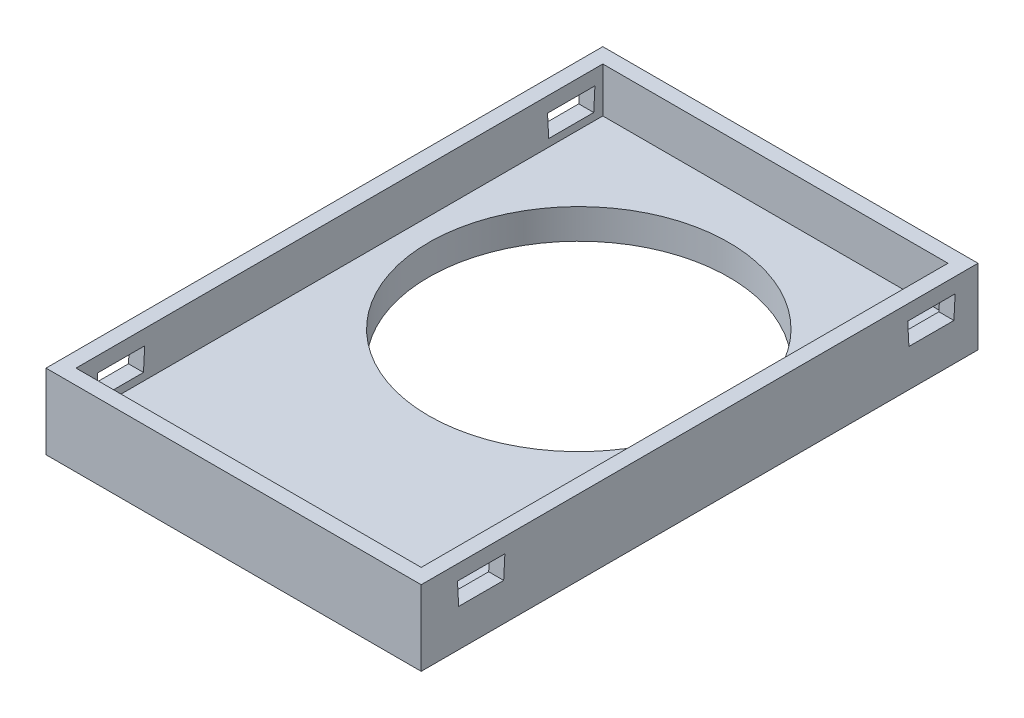
ISO-10303-21;
HEADER;
FILE_DESCRIPTION(('STEP AP214'),'2;1');
FILE_NAME('part.step','',(''),(''),'','','');
FILE_SCHEMA(('AUTOMOTIVE_DESIGN { 1 0 10303 214 1 1 1 1 }'));
ENDSEC;
DATA;
#1=APPLICATION_CONTEXT('core data for automotive mechanical design processes');
#2=APPLICATION_PROTOCOL_DEFINITION('international standard','automotive_design',2000,#1);
#3=PRODUCT_CONTEXT('',#1,'mechanical');
#4=PRODUCT('Part','Part','',(#3));
#5=PRODUCT_RELATED_PRODUCT_CATEGORY('part','',(#4));
#6=PRODUCT_DEFINITION_FORMATION('','',#4);
#7=PRODUCT_DEFINITION_CONTEXT('part definition',#1,'design');
#8=PRODUCT_DEFINITION('design','',#6,#7);
#9=PRODUCT_DEFINITION_SHAPE('','',#8);
#10=(LENGTH_UNIT() NAMED_UNIT(*) SI_UNIT(.MILLI.,.METRE.));
#11=(NAMED_UNIT(*) PLANE_ANGLE_UNIT() SI_UNIT($,.RADIAN.));
#12=(NAMED_UNIT(*) SI_UNIT($,.STERADIAN.) SOLID_ANGLE_UNIT());
#13=UNCERTAINTY_MEASURE_WITH_UNIT(LENGTH_MEASURE(1.E-05),#10,'distance_accuracy_value','');
#14=(GEOMETRIC_REPRESENTATION_CONTEXT(3) GLOBAL_UNCERTAINTY_ASSIGNED_CONTEXT((#13)) GLOBAL_UNIT_ASSIGNED_CONTEXT((#10,
#11,#12)) REPRESENTATION_CONTEXT('',''));
#15=CARTESIAN_POINT('',(0.,0.,0.));
#16=DIRECTION('',(0.,0.,1.));
#17=DIRECTION('',(1.,0.,0.));
#18=AXIS2_PLACEMENT_3D('',#15,#16,#17);
#19=CARTESIAN_POINT('',(0.,-2.,0.));
#20=DIRECTION('',(-1.,0.,0.));
#21=DIRECTION('',(0.,0.,1.));
#22=AXIS2_PLACEMENT_3D('',#19,#20,#21);
#23=PLANE('',#22);
#24=DIRECTION('',(0.,0.,1.));
#25=VECTOR('',#24,1.);
#26=CARTESIAN_POINT('',(2.0122792321331E-13,1.99999999999971,33.1038035472761));
#27=LINE('',#26,#25);
#28=CARTESIAN_POINT('',(2.0122792321331E-13,1.99999999999971,31.5251918783516));
#29=VERTEX_POINT('',#28);
#30=CARTESIAN_POINT('',(2.0122792321331E-13,1.99999999999971,34.6824152162007));
#31=VERTEX_POINT('',#30);
#32=EDGE_CURVE('E248',#29,#31,#27,.T.);
#33=ORIENTED_EDGE('',*,*,#32,.T.);
#34=DIRECTION('',(0.,0.998629534754574,0.0523359562429438));
#35=VECTOR('',#34,1.);
#36=CARTESIAN_POINT('',(2.1163626406917E-13,0.499999999999715,34.6038035472761));
#37=LINE('',#36,#35);
#38=CARTESIAN_POINT('',(0.,0.499999999999714,34.6038035472761));
#39=VERTEX_POINT('',#38);
#40=EDGE_CURVE('E233',#39,#31,#37,.T.);
#41=ORIENTED_EDGE('',*,*,#40,.F.);
#42=DIRECTION('',(0.,0.,-1.));
#43=VECTOR('',#42,1.);
#44=CARTESIAN_POINT('',(2.1163626406917E-13,0.499999999999715,33.1038035472761));
#45=LINE('',#44,#43);
#46=CARTESIAN_POINT('',(2.1163626406917E-13,0.499999999999715,31.6038035472761));
#47=VERTEX_POINT('',#46);
#48=EDGE_CURVE('E75',#39,#47,#45,.T.);
#49=ORIENTED_EDGE('',*,*,#48,.T.);
#50=DIRECTION('',(0.,0.998629534754574,-0.0523359562429438));
#51=VECTOR('',#50,1.);
#52=CARTESIAN_POINT('',(2.1163626406917E-13,0.421603652548974,31.6079121257499));
#53=LINE('',#52,#51);
#54=EDGE_CURVE('E225',#47,#29,#53,.T.);
#55=ORIENTED_EDGE('',*,*,#54,.T.);
#56=EDGE_LOOP('',(#33,#41,#49,#55));
#57=FACE_BOUND('',#56,.T.);
#58=DIRECTION('',(0.,0.,1.));
#59=VECTOR('',#58,1.);
#60=CARTESIAN_POINT('',(2.0122792321331E-13,1.99999999999971,3.10380354727614));
#61=LINE('',#60,#59);
#62=CARTESIAN_POINT('',(2.0122792321331E-13,1.99999999999971,1.52519187835157));
#63=VERTEX_POINT('',#62);
#64=CARTESIAN_POINT('',(2.0122792321331E-13,1.99999999999971,4.6824152162007));
#65=VERTEX_POINT('',#64);
#66=EDGE_CURVE('E276',#63,#65,#61,.T.);
#67=ORIENTED_EDGE('',*,*,#66,.T.);
#68=DIRECTION('',(0.,0.998629534754574,0.0523359562429438));
#69=VECTOR('',#68,1.);
#70=CARTESIAN_POINT('',(2.1163626406917E-13,0.499999999999715,4.60380354727614));
#71=LINE('',#70,#69);
#72=CARTESIAN_POINT('',(0.,0.499999999999715,4.60380354727614));
#73=VERTEX_POINT('',#72);
#74=EDGE_CURVE('E261',#73,#65,#71,.T.);
#75=ORIENTED_EDGE('',*,*,#74,.F.);
#76=DIRECTION('',(0.,0.,-1.));
#77=VECTOR('',#76,1.);
#78=CARTESIAN_POINT('',(2.1163626406917E-13,0.499999999999715,3.10380354727614));
#79=LINE('',#78,#77);
#80=CARTESIAN_POINT('',(2.1163626406917E-13,0.499999999999715,1.60380354727614));
#81=VERTEX_POINT('',#80);
#82=EDGE_CURVE('E262',#73,#81,#79,.T.);
#83=ORIENTED_EDGE('',*,*,#82,.T.);
#84=DIRECTION('',(0.,0.998629534754574,-0.0523359562429438));
#85=VECTOR('',#84,1.);
#86=CARTESIAN_POINT('',(2.1163626406917E-13,0.421603652548974,1.60791212574993));
#87=LINE('',#86,#85);
#88=EDGE_CURVE('E267',#81,#63,#87,.T.);
#89=ORIENTED_EDGE('',*,*,#88,.T.);
#90=EDGE_LOOP('',(#67,#75,#83,#89));
#91=FACE_BOUND('',#90,.T.);
#92=DIRECTION('',(0.,1.,0.));
#93=VECTOR('',#92,1.);
#94=CARTESIAN_POINT('',(0.,-2.,37.1));
#95=LINE('',#94,#93);
#96=CARTESIAN_POINT('',(0.,-2.,37.1));
#97=VERTEX_POINT('',#96);
#98=CARTESIAN_POINT('',(0.,3.,37.1));
#99=VERTEX_POINT('',#98);
#100=EDGE_CURVE('E402',#97,#99,#95,.T.);
#101=ORIENTED_EDGE('',*,*,#100,.T.);
#102=DIRECTION('',(0.,0.,1.));
#103=VECTOR('',#102,1.);
#104=CARTESIAN_POINT('',(0.,3.,0.));
#105=LINE('',#104,#103);
#106=CARTESIAN_POINT('',(0.,3.,0.));
#107=VERTEX_POINT('',#106);
#108=EDGE_CURVE('E350',#107,#99,#105,.T.);
#109=ORIENTED_EDGE('',*,*,#108,.F.);
#110=DIRECTION('',(0.,1.,0.));
#111=VECTOR('',#110,1.);
#112=CARTESIAN_POINT('',(0.,-2.,0.));
#113=LINE('',#112,#111);
#114=CARTESIAN_POINT('',(0.,-2.,0.));
#115=VERTEX_POINT('',#114);
#116=EDGE_CURVE('E403',#115,#107,#113,.T.);
#117=ORIENTED_EDGE('',*,*,#116,.F.);
#118=DIRECTION('',(0.,0.,1.));
#119=VECTOR('',#118,1.);
#120=CARTESIAN_POINT('',(0.,-2.,0.));
#121=LINE('',#120,#119);
#122=EDGE_CURVE('E390',#115,#97,#121,.T.);
#123=ORIENTED_EDGE('',*,*,#122,.T.);
#124=EDGE_LOOP('',(#101,#109,#117,#123));
#125=FACE_BOUND('',#124,.T.);
#126=ADVANCED_FACE('F61',(#57,#91,#125),#23,.T.);
#127=CARTESIAN_POINT('',(0.,-2.,0.));
#128=DIRECTION('',(0.,0.,1.));
#129=DIRECTION('',(1.,0.,0.));
#130=AXIS2_PLACEMENT_3D('',#127,#128,#129);
#131=PLANE('',#130);
#132=ORIENTED_EDGE('',*,*,#116,.T.);
#133=DIRECTION('',(1.,0.,0.));
#134=VECTOR('',#133,1.);
#135=CARTESIAN_POINT('',(0.,3.,0.));
#136=LINE('',#135,#134);
#137=CARTESIAN_POINT('',(25.,3.,0.));
#138=VERTEX_POINT('',#137);
#139=EDGE_CURVE('E346',#107,#138,#136,.T.);
#140=ORIENTED_EDGE('',*,*,#139,.T.);
#141=DIRECTION('',(0.,1.,0.));
#142=VECTOR('',#141,1.);
#143=CARTESIAN_POINT('',(25.,-2.,0.));
#144=LINE('',#143,#142);
#145=CARTESIAN_POINT('',(25.,-2.,0.));
#146=VERTEX_POINT('',#145);
#147=EDGE_CURVE('E406',#146,#138,#144,.T.);
#148=ORIENTED_EDGE('',*,*,#147,.F.);
#149=DIRECTION('',(1.,0.,0.));
#150=VECTOR('',#149,1.);
#151=CARTESIAN_POINT('',(0.,-2.,0.));
#152=LINE('',#151,#150);
#153=EDGE_CURVE('E400',#115,#146,#152,.T.);
#154=ORIENTED_EDGE('',*,*,#153,.F.);
#155=EDGE_LOOP('',(#132,#140,#148,#154));
#156=FACE_BOUND('',#155,.T.);
#157=ADVANCED_FACE('F435',(#156),#131,.F.);
#158=CARTESIAN_POINT('',(25.,-2.,0.));
#159=DIRECTION('',(-1.,0.,0.));
#160=DIRECTION('',(0.,0.,1.));
#161=AXIS2_PLACEMENT_3D('',#158,#159,#160);
#162=PLANE('',#161);
#163=DIRECTION('',(0.,0.998629534754574,0.0523359562429438));
#164=VECTOR('',#163,1.);
#165=CARTESIAN_POINT('',(24.9999999999998,0.499999999999715,34.6038035472761));
#166=LINE('',#165,#164);
#167=CARTESIAN_POINT('',(24.9999999999998,0.499999999999715,34.6038035472761));
#168=VERTEX_POINT('',#167);
#169=CARTESIAN_POINT('',(25.,1.99999999999972,34.6824152162007));
#170=VERTEX_POINT('',#169);
#171=EDGE_CURVE('E289',#168,#170,#166,.T.);
#172=ORIENTED_EDGE('',*,*,#171,.T.);
#173=DIRECTION('',(0.,0.,1.));
#174=VECTOR('',#173,1.);
#175=CARTESIAN_POINT('',(24.9999999999998,1.99999999999971,33.1038035472761));
#176=LINE('',#175,#174);
#177=CARTESIAN_POINT('',(24.9999999999998,1.99999999999971,31.5251918783516));
#178=VERTEX_POINT('',#177);
#179=EDGE_CURVE('E303',#178,#170,#176,.T.);
#180=ORIENTED_EDGE('',*,*,#179,.F.);
#181=DIRECTION('',(0.,0.998629534754574,-0.0523359562429438));
#182=VECTOR('',#181,1.);
#183=CARTESIAN_POINT('',(24.9999999999998,0.421603652548974,31.6079121257499));
#184=LINE('',#183,#182);
#185=CARTESIAN_POINT('',(24.9999999999998,0.499999999999715,31.6038035472761));
#186=VERTEX_POINT('',#185);
#187=EDGE_CURVE('E294',#186,#178,#184,.T.);
#188=ORIENTED_EDGE('',*,*,#187,.F.);
#189=DIRECTION('',(0.,0.,-1.));
#190=VECTOR('',#189,1.);
#191=CARTESIAN_POINT('',(24.9999999999998,0.499999999999715,33.1038035472761));
#192=LINE('',#191,#190);
#193=EDGE_CURVE('E290',#168,#186,#192,.T.);
#194=ORIENTED_EDGE('',*,*,#193,.F.);
#195=EDGE_LOOP('',(#172,#180,#188,#194));
#196=FACE_BOUND('',#195,.T.);
#197=DIRECTION('',(0.,0.998629534754574,0.0523359562429438));
#198=VECTOR('',#197,1.);
#199=CARTESIAN_POINT('',(24.9999999999998,0.499999999999715,4.60380354727614));
#200=LINE('',#199,#198);
#201=CARTESIAN_POINT('',(24.9999999999998,0.499999999999715,4.60380354727614));
#202=VERTEX_POINT('',#201);
#203=CARTESIAN_POINT('',(25.,1.99999999999972,4.6824152162007));
#204=VERTEX_POINT('',#203);
#205=EDGE_CURVE('E318',#202,#204,#200,.T.);
#206=ORIENTED_EDGE('',*,*,#205,.T.);
#207=DIRECTION('',(0.,0.,1.));
#208=VECTOR('',#207,1.);
#209=CARTESIAN_POINT('',(24.9999999999998,1.99999999999971,3.10380354727614));
#210=LINE('',#209,#208);
#211=CARTESIAN_POINT('',(24.9999999999998,1.99999999999971,1.52519187835157));
#212=VERTEX_POINT('',#211);
#213=EDGE_CURVE('E332',#212,#204,#210,.T.);
#214=ORIENTED_EDGE('',*,*,#213,.F.);
#215=DIRECTION('',(0.,0.998629534754574,-0.0523359562429438));
#216=VECTOR('',#215,1.);
#217=CARTESIAN_POINT('',(24.9999999999998,0.421603652548974,1.60791212574993));
#218=LINE('',#217,#216);
#219=CARTESIAN_POINT('',(24.9999999999998,0.499999999999715,1.60380354727614));
#220=VERTEX_POINT('',#219);
#221=EDGE_CURVE('E323',#220,#212,#218,.T.);
#222=ORIENTED_EDGE('',*,*,#221,.F.);
#223=DIRECTION('',(0.,0.,-1.));
#224=VECTOR('',#223,1.);
#225=CARTESIAN_POINT('',(24.9999999999998,0.499999999999715,3.10380354727614));
#226=LINE('',#225,#224);
#227=EDGE_CURVE('E319',#202,#220,#226,.T.);
#228=ORIENTED_EDGE('',*,*,#227,.F.);
#229=EDGE_LOOP('',(#206,#214,#222,#228));
#230=FACE_BOUND('',#229,.T.);
#231=ORIENTED_EDGE('',*,*,#147,.T.);
#232=DIRECTION('',(0.,0.,1.));
#233=VECTOR('',#232,1.);
#234=CARTESIAN_POINT('',(25.,3.,0.));
#235=LINE('',#234,#233);
#236=CARTESIAN_POINT('',(25.,3.,37.1));
#237=VERTEX_POINT('',#236);
#238=EDGE_CURVE('E343',#138,#237,#235,.T.);
#239=ORIENTED_EDGE('',*,*,#238,.T.);
#240=DIRECTION('',(0.,1.,0.));
#241=VECTOR('',#240,1.);
#242=CARTESIAN_POINT('',(25.,-2.,37.1));
#243=LINE('',#242,#241);
#244=CARTESIAN_POINT('',(25.,-2.,37.1));
#245=VERTEX_POINT('',#244);
#246=EDGE_CURVE('E408',#245,#237,#243,.T.);
#247=ORIENTED_EDGE('',*,*,#246,.F.);
#248=DIRECTION('',(0.,0.,1.));
#249=VECTOR('',#248,1.);
#250=CARTESIAN_POINT('',(25.,-2.,0.));
#251=LINE('',#250,#249);
#252=EDGE_CURVE('E398',#146,#245,#251,.T.);
#253=ORIENTED_EDGE('',*,*,#252,.F.);
#254=EDGE_LOOP('',(#231,#239,#247,#253));
#255=FACE_BOUND('',#254,.T.);
#256=ADVANCED_FACE('F450',(#196,#230,#255),#162,.F.);
#257=CARTESIAN_POINT('',(0.,-2.,37.1));
#258=DIRECTION('',(0.,0.,1.));
#259=DIRECTION('',(1.,0.,0.));
#260=AXIS2_PLACEMENT_3D('',#257,#258,#259);
#261=PLANE('',#260);
#262=ORIENTED_EDGE('',*,*,#246,.T.);
#263=DIRECTION('',(1.,0.,0.));
#264=VECTOR('',#263,1.);
#265=CARTESIAN_POINT('',(0.,3.,37.1));
#266=LINE('',#265,#264);
#267=EDGE_CURVE('E353',#99,#237,#266,.T.);
#268=ORIENTED_EDGE('',*,*,#267,.F.);
#269=ORIENTED_EDGE('',*,*,#100,.F.);
#270=DIRECTION('',(1.,0.,0.));
#271=VECTOR('',#270,1.);
#272=CARTESIAN_POINT('',(0.,-2.,37.1));
#273=LINE('',#272,#271);
#274=EDGE_CURVE('E395',#97,#245,#273,.T.);
#275=ORIENTED_EDGE('',*,*,#274,.T.);
#276=EDGE_LOOP('',(#262,#268,#269,#275));
#277=FACE_BOUND('',#276,.T.);
#278=ADVANCED_FACE('F446',(#277),#261,.T.);
#279=CARTESIAN_POINT('',(0.,-2.,0.));
#280=DIRECTION('',(0.,1.,0.));
#281=DIRECTION('',(0.,0.,1.));
#282=AXIS2_PLACEMENT_3D('',#279,#280,#281);
#283=PLANE('',#282);
#284=CARTESIAN_POINT('',(12.5,-2.,14.1));
#285=DIRECTION('',(0.,1.,0.));
#286=DIRECTION('',(0.,0.,1.));
#287=AXIS2_PLACEMENT_3D('',#284,#285,#286);
#288=CIRCLE('',#287,10.);
#289=CARTESIAN_POINT('',(12.5,-2.,24.1));
#290=VERTEX_POINT('',#289);
#291=EDGE_CURVE('E387',#290,#290,#288,.T.);
#292=ORIENTED_EDGE('',*,*,#291,.T.);
#293=EDGE_LOOP('',(#292));
#294=FACE_BOUND('',#293,.T.);
#295=ORIENTED_EDGE('',*,*,#122,.F.);
#296=ORIENTED_EDGE('',*,*,#153,.T.);
#297=ORIENTED_EDGE('',*,*,#252,.T.);
#298=ORIENTED_EDGE('',*,*,#274,.F.);
#299=EDGE_LOOP('',(#295,#296,#297,#298));
#300=FACE_BOUND('',#299,.T.);
#301=ADVANCED_FACE('F455',(#294,#300),#283,.F.);
#302=CARTESIAN_POINT('',(0.,0.,0.));
#303=DIRECTION('',(0.,1.,0.));
#304=DIRECTION('',(0.,0.,1.));
#305=AXIS2_PLACEMENT_3D('',#302,#303,#304);
#306=PLANE('',#305);
#307=DIRECTION('',(0.,0.,1.));
#308=VECTOR('',#307,1.);
#309=CARTESIAN_POINT('',(1.,0.,0.));
#310=LINE('',#309,#308);
#311=CARTESIAN_POINT('',(1.,0.,1.));
#312=VERTEX_POINT('',#311);
#313=CARTESIAN_POINT('',(1.,0.,36.1));
#314=VERTEX_POINT('',#313);
#315=EDGE_CURVE('E342',#312,#314,#310,.T.);
#316=ORIENTED_EDGE('',*,*,#315,.T.);
#317=DIRECTION('',(1.,0.,0.));
#318=VECTOR('',#317,1.);
#319=CARTESIAN_POINT('',(0.,0.,36.1));
#320=LINE('',#319,#318);
#321=CARTESIAN_POINT('',(24.,0.,36.1));
#322=VERTEX_POINT('',#321);
#323=EDGE_CURVE('E347',#314,#322,#320,.T.);
#324=ORIENTED_EDGE('',*,*,#323,.T.);
#325=DIRECTION('',(0.,0.,1.));
#326=VECTOR('',#325,1.);
#327=CARTESIAN_POINT('',(24.,0.,0.));
#328=LINE('',#327,#326);
#329=CARTESIAN_POINT('',(24.,0.,1.));
#330=VERTEX_POINT('',#329);
#331=EDGE_CURVE('E371',#330,#322,#328,.T.);
#332=ORIENTED_EDGE('',*,*,#331,.F.);
#333=DIRECTION('',(1.,0.,0.));
#334=VECTOR('',#333,1.);
#335=CARTESIAN_POINT('',(0.,0.,1.));
#336=LINE('',#335,#334);
#337=EDGE_CURVE('E368',#312,#330,#336,.T.);
#338=ORIENTED_EDGE('',*,*,#337,.F.);
#339=EDGE_LOOP('',(#316,#324,#332,#338));
#340=FACE_BOUND('',#339,.T.);
#341=CARTESIAN_POINT('',(12.5,0.,14.1));
#342=DIRECTION('',(0.,1.,0.));
#343=DIRECTION('',(0.,0.,1.));
#344=AXIS2_PLACEMENT_3D('',#341,#342,#343);
#345=CIRCLE('',#344,10.);
#346=CARTESIAN_POINT('',(12.5,0.,24.1));
#347=VERTEX_POINT('',#346);
#348=EDGE_CURVE('E386',#347,#347,#345,.T.);
#349=ORIENTED_EDGE('',*,*,#348,.F.);
#350=EDGE_LOOP('',(#349));
#351=FACE_BOUND('',#350,.T.);
#352=ADVANCED_FACE('F457',(#340,#351),#306,.T.);
#353=CARTESIAN_POINT('',(12.5,-2.,14.1));
#354=DIRECTION('',(0.,1.,0.));
#355=DIRECTION('',(0.,0.,1.));
#356=AXIS2_PLACEMENT_3D('',#353,#354,#355);
#357=CYLINDRICAL_SURFACE('',#356,10.);
#358=ORIENTED_EDGE('',*,*,#348,.T.);
#359=EDGE_LOOP('',(#358));
#360=FACE_BOUND('',#359,.T.);
#361=ORIENTED_EDGE('',*,*,#291,.F.);
#362=EDGE_LOOP('',(#361));
#363=FACE_BOUND('',#362,.T.);
#364=ADVANCED_FACE('F464',(#360,#363),#357,.F.);
#365=CARTESIAN_POINT('',(1.,3.,0.));
#366=DIRECTION('',(1.,0.,0.));
#367=DIRECTION('',(0.,0.,-1.));
#368=AXIS2_PLACEMENT_3D('',#365,#366,#367);
#369=PLANE('',#368);
#370=DIRECTION('',(0.,0.,1.));
#371=VECTOR('',#370,1.);
#372=CARTESIAN_POINT('',(1.,3.,0.));
#373=LINE('',#372,#371);
#374=CARTESIAN_POINT('',(1.,3.,1.));
#375=VERTEX_POINT('',#374);
#376=CARTESIAN_POINT('',(1.,3.,36.1));
#377=VERTEX_POINT('',#376);
#378=EDGE_CURVE('E356',#375,#377,#373,.T.);
#379=ORIENTED_EDGE('',*,*,#378,.T.);
#380=DIRECTION('',(0.,-1.,0.));
#381=VECTOR('',#380,1.);
#382=CARTESIAN_POINT('',(1.,3.,36.1));
#383=LINE('',#382,#381);
#384=EDGE_CURVE('E366',#377,#314,#383,.T.);
#385=ORIENTED_EDGE('',*,*,#384,.T.);
#386=ORIENTED_EDGE('',*,*,#315,.F.);
#387=DIRECTION('',(0.,-1.,0.));
#388=VECTOR('',#387,1.);
#389=CARTESIAN_POINT('',(1.,3.,1.));
#390=LINE('',#389,#388);
#391=EDGE_CURVE('E383',#375,#312,#390,.T.);
#392=ORIENTED_EDGE('',*,*,#391,.F.);
#393=EDGE_LOOP('',(#379,#385,#386,#392));
#394=FACE_BOUND('',#393,.T.);
#395=DIRECTION('',(0.,0.,-1.));
#396=VECTOR('',#395,1.);
#397=CARTESIAN_POINT('',(1.0000000000002,1.99999999999972,33.1038035472761));
#398=LINE('',#397,#396);
#399=CARTESIAN_POINT('',(1.,1.99999999999972,34.6824152162007));
#400=VERTEX_POINT('',#399);
#401=CARTESIAN_POINT('',(1.0000000000002,1.99999999999972,31.5251918783516));
#402=VERTEX_POINT('',#401);
#403=EDGE_CURVE('E83',#400,#402,#398,.T.);
#404=ORIENTED_EDGE('',*,*,#403,.T.);
#405=DIRECTION('',(0.,0.998629534754574,-0.0523359562429438));
#406=VECTOR('',#405,1.);
#407=CARTESIAN_POINT('',(1.,4.64490087831513,31.3865784968953));
#408=LINE('',#407,#406);
#409=CARTESIAN_POINT('',(1.,0.499999999999722,31.6038035472761));
#410=VERTEX_POINT('',#409);
#411=EDGE_CURVE('E252',#410,#402,#408,.T.);
#412=ORIENTED_EDGE('',*,*,#411,.F.);
#413=DIRECTION('',(0.,0.,-1.));
#414=VECTOR('',#413,1.);
#415=CARTESIAN_POINT('',(1.,0.499999999999722,0.));
#416=LINE('',#415,#414);
#417=CARTESIAN_POINT('',(1.,0.499999999999722,34.6038035472761));
#418=VERTEX_POINT('',#417);
#419=EDGE_CURVE('E12',#418,#410,#416,.T.);
#420=ORIENTED_EDGE('',*,*,#419,.F.);
#421=DIRECTION('',(0.,-0.998629534754574,-0.0523359562429438));
#422=VECTOR('',#421,1.);
#423=CARTESIAN_POINT('',(1.,1.18461116520407,34.6396824981169));
#424=LINE('',#423,#422);
#425=EDGE_CURVE('E247',#400,#418,#424,.T.);
#426=ORIENTED_EDGE('',*,*,#425,.F.);
#427=EDGE_LOOP('',(#404,#412,#420,#426));
#428=FACE_BOUND('',#427,.T.);
#429=DIRECTION('',(0.,0.,-1.));
#430=VECTOR('',#429,1.);
#431=CARTESIAN_POINT('',(1.0000000000002,1.99999999999972,3.10380354727614));
#432=LINE('',#431,#430);
#433=CARTESIAN_POINT('',(1.,1.99999999999972,4.6824152162007));
#434=VERTEX_POINT('',#433);
#435=CARTESIAN_POINT('',(1.0000000000002,1.99999999999972,1.52519187835157));
#436=VERTEX_POINT('',#435);
#437=EDGE_CURVE('E254',#434,#436,#432,.T.);
#438=ORIENTED_EDGE('',*,*,#437,.T.);
#439=DIRECTION('',(0.,0.998629534754574,-0.0523359562429438));
#440=VECTOR('',#439,1.);
#441=CARTESIAN_POINT('',(1.,3.07697392930033,1.4687500663712));
#442=LINE('',#441,#440);
#443=CARTESIAN_POINT('',(1.,0.499999999999722,1.60380354727614));
#444=VERTEX_POINT('',#443);
#445=EDGE_CURVE('E282',#444,#436,#442,.T.);
#446=ORIENTED_EDGE('',*,*,#445,.F.);
#447=DIRECTION('',(0.,0.,-1.));
#448=VECTOR('',#447,1.);
#449=CARTESIAN_POINT('',(1.,0.499999999999722,0.));
#450=LINE('',#449,#448);
#451=CARTESIAN_POINT('',(1.,0.499999999999722,4.60380354727614));
#452=VERTEX_POINT('',#451);
#453=EDGE_CURVE('E68',#452,#444,#450,.T.);
#454=ORIENTED_EDGE('',*,*,#453,.F.);
#455=DIRECTION('',(0.,-0.998629534754574,-0.0523359562429438));
#456=VECTOR('',#455,1.);
#457=CARTESIAN_POINT('',(1.,2.75253811421887,4.72185406759277));
#458=LINE('',#457,#456);
#459=EDGE_CURVE('E275',#434,#452,#458,.T.);
#460=ORIENTED_EDGE('',*,*,#459,.F.);
#461=EDGE_LOOP('',(#438,#446,#454,#460));
#462=FACE_BOUND('',#461,.T.);
#463=ADVANCED_FACE('F426',(#394,#428,#462),#369,.T.);
#464=CARTESIAN_POINT('',(0.,3.,1.));
#465=DIRECTION('',(0.,0.,-1.));
#466=DIRECTION('',(-1.,0.,0.));
#467=AXIS2_PLACEMENT_3D('',#464,#465,#466);
#468=PLANE('',#467);
#469=ORIENTED_EDGE('',*,*,#337,.T.);
#470=DIRECTION('',(0.,-1.,0.));
#471=VECTOR('',#470,1.);
#472=CARTESIAN_POINT('',(24.,3.,1.));
#473=LINE('',#472,#471);
#474=CARTESIAN_POINT('',(24.,3.,1.));
#475=VERTEX_POINT('',#474);
#476=EDGE_CURVE('E380',#475,#330,#473,.T.);
#477=ORIENTED_EDGE('',*,*,#476,.F.);
#478=DIRECTION('',(1.,0.,0.));
#479=VECTOR('',#478,1.);
#480=CARTESIAN_POINT('',(0.,3.,1.));
#481=LINE('',#480,#479);
#482=EDGE_CURVE('E358',#375,#475,#481,.T.);
#483=ORIENTED_EDGE('',*,*,#482,.F.);
#484=ORIENTED_EDGE('',*,*,#391,.T.);
#485=EDGE_LOOP('',(#469,#477,#483,#484));
#486=FACE_BOUND('',#485,.T.);
#487=ADVANCED_FACE('F500',(#486),#468,.F.);
#488=CARTESIAN_POINT('',(24.,3.,0.));
#489=DIRECTION('',(1.,0.,0.));
#490=DIRECTION('',(0.,0.,-1.));
#491=AXIS2_PLACEMENT_3D('',#488,#489,#490);
#492=PLANE('',#491);
#493=DIRECTION('',(0.,-1.,0.));
#494=VECTOR('',#493,1.);
#495=CARTESIAN_POINT('',(24.,3.,36.1));
#496=LINE('',#495,#494);
#497=CARTESIAN_POINT('',(24.,3.,36.1));
#498=VERTEX_POINT('',#497);
#499=EDGE_CURVE('E377',#498,#322,#496,.T.);
#500=ORIENTED_EDGE('',*,*,#499,.F.);
#501=DIRECTION('',(0.,0.,1.));
#502=VECTOR('',#501,1.);
#503=CARTESIAN_POINT('',(24.,3.,0.));
#504=LINE('',#503,#502);
#505=EDGE_CURVE('E361',#475,#498,#504,.T.);
#506=ORIENTED_EDGE('',*,*,#505,.F.);
#507=ORIENTED_EDGE('',*,*,#476,.T.);
#508=ORIENTED_EDGE('',*,*,#331,.T.);
#509=EDGE_LOOP('',(#500,#506,#507,#508));
#510=FACE_BOUND('',#509,.T.);
#511=DIRECTION('',(0.,0.998629534754574,-0.0523359562429438));
#512=VECTOR('',#511,1.);
#513=CARTESIAN_POINT('',(24.,4.64490087831513,31.3865784968953));
#514=LINE('',#513,#512);
#515=CARTESIAN_POINT('',(24.,0.499999999999722,31.6038035472761));
#516=VERTEX_POINT('',#515);
#517=CARTESIAN_POINT('',(23.9999999999998,1.99999999999972,31.5251918783516));
#518=VERTEX_POINT('',#517);
#519=EDGE_CURVE('E310',#516,#518,#514,.T.);
#520=ORIENTED_EDGE('',*,*,#519,.T.);
#521=DIRECTION('',(0.,0.,-1.));
#522=VECTOR('',#521,1.);
#523=CARTESIAN_POINT('',(23.9999999999998,1.99999999999972,33.1038035472761));
#524=LINE('',#523,#522);
#525=CARTESIAN_POINT('',(23.9999999999998,1.99999999999972,34.6824152162007));
#526=VERTEX_POINT('',#525);
#527=EDGE_CURVE('E284',#526,#518,#524,.T.);
#528=ORIENTED_EDGE('',*,*,#527,.F.);
#529=DIRECTION('',(0.,-0.998629534754574,-0.0523359562429438));
#530=VECTOR('',#529,1.);
#531=CARTESIAN_POINT('',(24.,1.18461116520407,34.6396824981169));
#532=LINE('',#531,#530);
#533=CARTESIAN_POINT('',(24.,0.499999999999715,34.6038035472761));
#534=VERTEX_POINT('',#533);
#535=EDGE_CURVE('E302',#526,#534,#532,.T.);
#536=ORIENTED_EDGE('',*,*,#535,.T.);
#537=DIRECTION('',(0.,0.,-1.));
#538=VECTOR('',#537,1.);
#539=CARTESIAN_POINT('',(24.,0.499999999999722,0.));
#540=LINE('',#539,#538);
#541=EDGE_CURVE('E413',#534,#516,#540,.T.);
#542=ORIENTED_EDGE('',*,*,#541,.T.);
#543=EDGE_LOOP('',(#520,#528,#536,#542));
#544=FACE_BOUND('',#543,.T.);
#545=DIRECTION('',(0.,0.998629534754574,-0.0523359562429438));
#546=VECTOR('',#545,1.);
#547=CARTESIAN_POINT('',(24.,3.07697392930033,1.4687500663712));
#548=LINE('',#547,#546);
#549=CARTESIAN_POINT('',(24.,0.499999999999722,1.60380354727614));
#550=VERTEX_POINT('',#549);
#551=CARTESIAN_POINT('',(23.9999999999998,1.99999999999972,1.52519187835157));
#552=VERTEX_POINT('',#551);
#553=EDGE_CURVE('E339',#550,#552,#548,.T.);
#554=ORIENTED_EDGE('',*,*,#553,.T.);
#555=DIRECTION('',(0.,0.,-1.));
#556=VECTOR('',#555,1.);
#557=CARTESIAN_POINT('',(23.9999999999998,1.99999999999972,3.10380354727614));
#558=LINE('',#557,#556);
#559=CARTESIAN_POINT('',(23.9999999999998,1.99999999999972,4.6824152162007));
#560=VERTEX_POINT('',#559);
#561=EDGE_CURVE('E313',#560,#552,#558,.T.);
#562=ORIENTED_EDGE('',*,*,#561,.F.);
#563=DIRECTION('',(0.,-0.998629534754574,-0.0523359562429438));
#564=VECTOR('',#563,1.);
#565=CARTESIAN_POINT('',(24.,2.75253811421887,4.72185406759277));
#566=LINE('',#565,#564);
#567=CARTESIAN_POINT('',(24.,0.499999999999715,4.60380354727614));
#568=VERTEX_POINT('',#567);
#569=EDGE_CURVE('E331',#560,#568,#566,.T.);
#570=ORIENTED_EDGE('',*,*,#569,.T.);
#571=DIRECTION('',(0.,0.,-1.));
#572=VECTOR('',#571,1.);
#573=CARTESIAN_POINT('',(24.,0.499999999999722,0.));
#574=LINE('',#573,#572);
#575=EDGE_CURVE('E405',#568,#550,#574,.T.);
#576=ORIENTED_EDGE('',*,*,#575,.T.);
#577=EDGE_LOOP('',(#554,#562,#570,#576));
#578=FACE_BOUND('',#577,.T.);
#579=ADVANCED_FACE('F497',(#510,#544,#578),#492,.F.);
#580=CARTESIAN_POINT('',(0.,3.,36.1));
#581=DIRECTION('',(0.,0.,-1.));
#582=DIRECTION('',(-1.,0.,0.));
#583=AXIS2_PLACEMENT_3D('',#580,#581,#582);
#584=PLANE('',#583);
#585=ORIENTED_EDGE('',*,*,#323,.F.);
#586=ORIENTED_EDGE('',*,*,#384,.F.);
#587=DIRECTION('',(1.,0.,0.));
#588=VECTOR('',#587,1.);
#589=CARTESIAN_POINT('',(0.,3.,36.1));
#590=LINE('',#589,#588);
#591=EDGE_CURVE('E363',#377,#498,#590,.T.);
#592=ORIENTED_EDGE('',*,*,#591,.T.);
#593=ORIENTED_EDGE('',*,*,#499,.T.);
#594=EDGE_LOOP('',(#585,#586,#592,#593));
#595=FACE_BOUND('',#594,.T.);
#596=ADVANCED_FACE('F499',(#595),#584,.T.);
#597=CARTESIAN_POINT('',(0.,3.,0.));
#598=DIRECTION('',(0.,1.,0.));
#599=DIRECTION('',(0.,0.,1.));
#600=AXIS2_PLACEMENT_3D('',#597,#598,#599);
#601=PLANE('',#600);
#602=ORIENTED_EDGE('',*,*,#238,.F.);
#603=ORIENTED_EDGE('',*,*,#139,.F.);
#604=ORIENTED_EDGE('',*,*,#108,.T.);
#605=ORIENTED_EDGE('',*,*,#267,.T.);
#606=EDGE_LOOP('',(#602,#603,#604,#605));
#607=FACE_BOUND('',#606,.T.);
#608=ORIENTED_EDGE('',*,*,#378,.F.);
#609=ORIENTED_EDGE('',*,*,#482,.T.);
#610=ORIENTED_EDGE('',*,*,#505,.T.);
#611=ORIENTED_EDGE('',*,*,#591,.F.);
#612=EDGE_LOOP('',(#608,#609,#610,#611));
#613=FACE_BOUND('',#612,.T.);
#614=ADVANCED_FACE('F444',(#607,#613),#601,.T.);
#615=CARTESIAN_POINT('',(23.9999999999998,0.499999999999722,3.10380354727614));
#616=DIRECTION('',(0.,-1.,0.));
#617=DIRECTION('',(0.,0.,-1.));
#618=AXIS2_PLACEMENT_3D('',#615,#616,#617);
#619=PLANE('',#618);
#620=DIRECTION('',(1.,0.,0.));
#621=VECTOR('',#620,1.);
#622=CARTESIAN_POINT('',(23.9999999999998,0.499999999999722,4.60380354727614));
#623=LINE('',#622,#621);
#624=EDGE_CURVE('E316',#568,#202,#623,.T.);
#625=ORIENTED_EDGE('',*,*,#624,.T.);
#626=ORIENTED_EDGE('',*,*,#227,.T.);
#627=DIRECTION('',(-1.,0.,0.));
#628=VECTOR('',#627,1.);
#629=CARTESIAN_POINT('',(23.9999999999998,0.499999999999722,1.60380354727614));
#630=LINE('',#629,#628);
#631=EDGE_CURVE('E315',#220,#550,#630,.T.);
#632=ORIENTED_EDGE('',*,*,#631,.T.);
#633=ORIENTED_EDGE('',*,*,#575,.F.);
#634=EDGE_LOOP('',(#625,#626,#632,#633));
#635=FACE_BOUND('',#634,.T.);
#636=ADVANCED_FACE('F495',(#635),#619,.F.);
#637=CARTESIAN_POINT('',(23.9999999999998,0.499999999999722,1.60380354727614));
#638=DIRECTION('',(0.,-0.0523359562429438,-0.998629534754574));
#639=DIRECTION('',(0.,0.998629534754574,-0.0523359562429438));
#640=AXIS2_PLACEMENT_3D('',#637,#638,#639);
#641=PLANE('',#640);
#642=ORIENTED_EDGE('',*,*,#631,.F.);
#643=ORIENTED_EDGE('',*,*,#221,.T.);
#644=DIRECTION('',(1.,0.,0.));
#645=VECTOR('',#644,1.);
#646=CARTESIAN_POINT('',(23.9999999999998,1.99999999999972,1.52519187835157));
#647=LINE('',#646,#645);
#648=EDGE_CURVE('E329',#552,#212,#647,.T.);
#649=ORIENTED_EDGE('',*,*,#648,.F.);
#650=ORIENTED_EDGE('',*,*,#553,.F.);
#651=EDGE_LOOP('',(#642,#643,#649,#650));
#652=FACE_BOUND('',#651,.T.);
#653=ADVANCED_FACE('F493',(#652),#641,.F.);
#654=CARTESIAN_POINT('',(23.9999999999998,0.499999999999722,4.60380354727614));
#655=DIRECTION('',(0.,-0.0523359562429438,0.998629534754574));
#656=DIRECTION('',(0.,-0.998629534754574,-0.0523359562429438));
#657=AXIS2_PLACEMENT_3D('',#654,#655,#656);
#658=PLANE('',#657);
#659=DIRECTION('',(-1.,0.,0.));
#660=VECTOR('',#659,1.);
#661=CARTESIAN_POINT('',(23.9999999999998,1.99999999999972,4.6824152162007));
#662=LINE('',#661,#660);
#663=EDGE_CURVE('E326',#204,#560,#662,.T.);
#664=ORIENTED_EDGE('',*,*,#663,.F.);
#665=ORIENTED_EDGE('',*,*,#205,.F.);
#666=ORIENTED_EDGE('',*,*,#624,.F.);
#667=ORIENTED_EDGE('',*,*,#569,.F.);
#668=EDGE_LOOP('',(#664,#665,#666,#667));
#669=FACE_BOUND('',#668,.T.);
#670=ADVANCED_FACE('F485',(#669),#658,.F.);
#671=CARTESIAN_POINT('',(23.9999999999998,1.99999999999972,3.10380354727614));
#672=DIRECTION('',(0.,1.,0.));
#673=DIRECTION('',(-1.,0.,0.));
#674=AXIS2_PLACEMENT_3D('',#671,#672,#673);
#675=PLANE('',#674);
#676=ORIENTED_EDGE('',*,*,#561,.T.);
#677=ORIENTED_EDGE('',*,*,#648,.T.);
#678=ORIENTED_EDGE('',*,*,#213,.T.);
#679=ORIENTED_EDGE('',*,*,#663,.T.);
#680=EDGE_LOOP('',(#676,#677,#678,#679));
#681=FACE_BOUND('',#680,.T.);
#682=ADVANCED_FACE('F489',(#681),#675,.F.);
#683=CARTESIAN_POINT('',(23.9999999999998,0.499999999999722,33.1038035472761));
#684=DIRECTION('',(0.,-1.,0.));
#685=DIRECTION('',(0.,0.,-1.));
#686=AXIS2_PLACEMENT_3D('',#683,#684,#685);
#687=PLANE('',#686);
#688=DIRECTION('',(1.,0.,0.));
#689=VECTOR('',#688,1.);
#690=CARTESIAN_POINT('',(23.9999999999998,0.499999999999722,34.6038035472761));
#691=LINE('',#690,#689);
#692=EDGE_CURVE('E287',#534,#168,#691,.T.);
#693=ORIENTED_EDGE('',*,*,#692,.T.);
#694=ORIENTED_EDGE('',*,*,#193,.T.);
#695=DIRECTION('',(-1.,0.,0.));
#696=VECTOR('',#695,1.);
#697=CARTESIAN_POINT('',(23.9999999999998,0.499999999999722,31.6038035472761));
#698=LINE('',#697,#696);
#699=EDGE_CURVE('E286',#186,#516,#698,.T.);
#700=ORIENTED_EDGE('',*,*,#699,.T.);
#701=ORIENTED_EDGE('',*,*,#541,.F.);
#702=EDGE_LOOP('',(#693,#694,#700,#701));
#703=FACE_BOUND('',#702,.T.);
#704=ADVANCED_FACE('F544',(#703),#687,.F.);
#705=CARTESIAN_POINT('',(23.9999999999998,0.499999999999722,31.6038035472761));
#706=DIRECTION('',(0.,-0.0523359562429438,-0.998629534754574));
#707=DIRECTION('',(0.,0.998629534754574,-0.0523359562429438));
#708=AXIS2_PLACEMENT_3D('',#705,#706,#707);
#709=PLANE('',#708);
#710=ORIENTED_EDGE('',*,*,#699,.F.);
#711=ORIENTED_EDGE('',*,*,#187,.T.);
#712=DIRECTION('',(1.,0.,0.));
#713=VECTOR('',#712,1.);
#714=CARTESIAN_POINT('',(23.9999999999998,1.99999999999972,31.5251918783516));
#715=LINE('',#714,#713);
#716=EDGE_CURVE('E300',#518,#178,#715,.T.);
#717=ORIENTED_EDGE('',*,*,#716,.F.);
#718=ORIENTED_EDGE('',*,*,#519,.F.);
#719=EDGE_LOOP('',(#710,#711,#717,#718));
#720=FACE_BOUND('',#719,.T.);
#721=ADVANCED_FACE('F547',(#720),#709,.F.);
#722=CARTESIAN_POINT('',(23.9999999999998,0.499999999999722,34.6038035472761));
#723=DIRECTION('',(0.,-0.0523359562429438,0.998629534754574));
#724=DIRECTION('',(0.,-0.998629534754574,-0.0523359562429438));
#725=AXIS2_PLACEMENT_3D('',#722,#723,#724);
#726=PLANE('',#725);
#727=DIRECTION('',(-1.,0.,0.));
#728=VECTOR('',#727,1.);
#729=CARTESIAN_POINT('',(23.9999999999998,1.99999999999972,34.6824152162007));
#730=LINE('',#729,#728);
#731=EDGE_CURVE('E297',#170,#526,#730,.T.);
#732=ORIENTED_EDGE('',*,*,#731,.F.);
#733=ORIENTED_EDGE('',*,*,#171,.F.);
#734=ORIENTED_EDGE('',*,*,#692,.F.);
#735=ORIENTED_EDGE('',*,*,#535,.F.);
#736=EDGE_LOOP('',(#732,#733,#734,#735));
#737=FACE_BOUND('',#736,.T.);
#738=ADVANCED_FACE('F551',(#737),#726,.F.);
#739=CARTESIAN_POINT('',(23.9999999999998,1.99999999999972,33.1038035472761));
#740=DIRECTION('',(0.,1.,0.));
#741=DIRECTION('',(-1.,0.,0.));
#742=AXIS2_PLACEMENT_3D('',#739,#740,#741);
#743=PLANE('',#742);
#744=ORIENTED_EDGE('',*,*,#527,.T.);
#745=ORIENTED_EDGE('',*,*,#716,.T.);
#746=ORIENTED_EDGE('',*,*,#179,.T.);
#747=ORIENTED_EDGE('',*,*,#731,.T.);
#748=EDGE_LOOP('',(#744,#745,#746,#747));
#749=FACE_BOUND('',#748,.T.);
#750=ADVANCED_FACE('F543',(#749),#743,.F.);
#751=CARTESIAN_POINT('',(1.0000000000002,1.99999999999972,3.10380354727614));
#752=DIRECTION('',(0.,1.,0.));
#753=DIRECTION('',(1.,0.,0.));
#754=AXIS2_PLACEMENT_3D('',#751,#752,#753);
#755=PLANE('',#754);
#756=ORIENTED_EDGE('',*,*,#437,.F.);
#757=DIRECTION('',(1.,0.,0.));
#758=VECTOR('',#757,1.);
#759=CARTESIAN_POINT('',(1.0000000000002,1.99999999999972,4.6824152162007));
#760=LINE('',#759,#758);
#761=EDGE_CURVE('E270',#65,#434,#760,.T.);
#762=ORIENTED_EDGE('',*,*,#761,.F.);
#763=ORIENTED_EDGE('',*,*,#66,.F.);
#764=DIRECTION('',(-1.,0.,0.));
#765=VECTOR('',#764,1.);
#766=CARTESIAN_POINT('',(1.0000000000002,1.99999999999972,1.52519187835157));
#767=LINE('',#766,#765);
#768=EDGE_CURVE('E272',#436,#63,#767,.T.);
#769=ORIENTED_EDGE('',*,*,#768,.F.);
#770=EDGE_LOOP('',(#756,#762,#763,#769));
#771=FACE_BOUND('',#770,.T.);
#772=ADVANCED_FACE('F429',(#771),#755,.F.);
#773=CARTESIAN_POINT('',(1.00000000000021,0.499999999999722,1.60380354727614));
#774=DIRECTION('',(0.,-0.0523359562429438,-0.998629534754574));
#775=DIRECTION('',(0.,0.998629534754574,-0.0523359562429438));
#776=AXIS2_PLACEMENT_3D('',#773,#774,#775);
#777=PLANE('',#776);
#778=ORIENTED_EDGE('',*,*,#445,.T.);
#779=ORIENTED_EDGE('',*,*,#768,.T.);
#780=ORIENTED_EDGE('',*,*,#88,.F.);
#781=DIRECTION('',(1.,0.,0.));
#782=VECTOR('',#781,1.);
#783=CARTESIAN_POINT('',(1.00000000000021,0.499999999999722,1.60380354727614));
#784=LINE('',#783,#782);
#785=EDGE_CURVE('E257',#81,#444,#784,.T.);
#786=ORIENTED_EDGE('',*,*,#785,.T.);
#787=EDGE_LOOP('',(#778,#779,#780,#786));
#788=FACE_BOUND('',#787,.T.);
#789=ADVANCED_FACE('F424',(#788),#777,.F.);
#790=CARTESIAN_POINT('',(1.00000000000021,0.499999999999722,3.10380354727614));
#791=DIRECTION('',(0.,-1.,0.));
#792=DIRECTION('',(0.,0.,-1.));
#793=AXIS2_PLACEMENT_3D('',#790,#791,#792);
#794=PLANE('',#793);
#795=ORIENTED_EDGE('',*,*,#453,.T.);
#796=ORIENTED_EDGE('',*,*,#785,.F.);
#797=ORIENTED_EDGE('',*,*,#82,.F.);
#798=DIRECTION('',(-1.,0.,0.));
#799=VECTOR('',#798,1.);
#800=CARTESIAN_POINT('',(1.00000000000021,0.499999999999722,4.60380354727614));
#801=LINE('',#800,#799);
#802=EDGE_CURVE('E258',#452,#73,#801,.T.);
#803=ORIENTED_EDGE('',*,*,#802,.F.);
#804=EDGE_LOOP('',(#795,#796,#797,#803));
#805=FACE_BOUND('',#804,.T.);
#806=ADVANCED_FACE('F419',(#805),#794,.F.);
#807=CARTESIAN_POINT('',(1.00000000000021,0.499999999999722,4.60380354727614));
#808=DIRECTION('',(0.,-0.0523359562429438,0.998629534754574));
#809=DIRECTION('',(0.,-0.998629534754574,-0.0523359562429438));
#810=AXIS2_PLACEMENT_3D('',#807,#808,#809);
#811=PLANE('',#810);
#812=ORIENTED_EDGE('',*,*,#459,.T.);
#813=ORIENTED_EDGE('',*,*,#802,.T.);
#814=ORIENTED_EDGE('',*,*,#74,.T.);
#815=ORIENTED_EDGE('',*,*,#761,.T.);
#816=EDGE_LOOP('',(#812,#813,#814,#815));
#817=FACE_BOUND('',#816,.T.);
#818=ADVANCED_FACE('F431',(#817),#811,.F.);
#819=CARTESIAN_POINT('',(1.0000000000002,1.99999999999972,33.1038035472761));
#820=DIRECTION('',(0.,1.,0.));
#821=DIRECTION('',(1.,0.,0.));
#822=AXIS2_PLACEMENT_3D('',#819,#820,#821);
#823=PLANE('',#822);
#824=ORIENTED_EDGE('',*,*,#403,.F.);
#825=DIRECTION('',(1.,0.,0.));
#826=VECTOR('',#825,1.);
#827=CARTESIAN_POINT('',(1.0000000000002,1.99999999999972,34.6824152162007));
#828=LINE('',#827,#826);
#829=EDGE_CURVE('E232',#31,#400,#828,.T.);
#830=ORIENTED_EDGE('',*,*,#829,.F.);
#831=ORIENTED_EDGE('',*,*,#32,.F.);
#832=DIRECTION('',(-1.,0.,0.));
#833=VECTOR('',#832,1.);
#834=CARTESIAN_POINT('',(1.0000000000002,1.99999999999972,31.5251918783516));
#835=LINE('',#834,#833);
#836=EDGE_CURVE('E229',#402,#29,#835,.T.);
#837=ORIENTED_EDGE('',*,*,#836,.F.);
#838=EDGE_LOOP('',(#824,#830,#831,#837));
#839=FACE_BOUND('',#838,.T.);
#840=ADVANCED_FACE('F526',(#839),#823,.F.);
#841=CARTESIAN_POINT('',(1.00000000000021,0.499999999999722,31.6038035472761));
#842=DIRECTION('',(0.,-0.0523359562429438,-0.998629534754574));
#843=DIRECTION('',(0.,0.998629534754574,-0.0523359562429438));
#844=AXIS2_PLACEMENT_3D('',#841,#842,#843);
#845=PLANE('',#844);
#846=ORIENTED_EDGE('',*,*,#411,.T.);
#847=ORIENTED_EDGE('',*,*,#836,.T.);
#848=ORIENTED_EDGE('',*,*,#54,.F.);
#849=DIRECTION('',(1.,0.,0.));
#850=VECTOR('',#849,1.);
#851=CARTESIAN_POINT('',(1.00000000000021,0.499999999999722,31.6038035472761));
#852=LINE('',#851,#850);
#853=EDGE_CURVE('E227',#47,#410,#852,.T.);
#854=ORIENTED_EDGE('',*,*,#853,.T.);
#855=EDGE_LOOP('',(#846,#847,#848,#854));
#856=FACE_BOUND('',#855,.T.);
#857=ADVANCED_FACE('F226',(#856),#845,.F.);
#858=CARTESIAN_POINT('',(1.00000000000021,0.499999999999722,33.1038035472761));
#859=DIRECTION('',(0.,-1.,0.));
#860=DIRECTION('',(0.,0.,-1.));
#861=AXIS2_PLACEMENT_3D('',#858,#859,#860);
#862=PLANE('',#861);
#863=ORIENTED_EDGE('',*,*,#419,.T.);
#864=ORIENTED_EDGE('',*,*,#853,.F.);
#865=ORIENTED_EDGE('',*,*,#48,.F.);
#866=DIRECTION('',(-1.,0.,0.));
#867=VECTOR('',#866,1.);
#868=CARTESIAN_POINT('',(1.00000000000021,0.499999999999722,34.6038035472761));
#869=LINE('',#868,#867);
#870=EDGE_CURVE('E240',#418,#39,#869,.T.);
#871=ORIENTED_EDGE('',*,*,#870,.F.);
#872=EDGE_LOOP('',(#863,#864,#865,#871));
#873=FACE_BOUND('',#872,.T.);
#874=ADVANCED_FACE('F235',(#873),#862,.F.);
#875=CARTESIAN_POINT('',(1.00000000000021,0.499999999999722,34.6038035472761));
#876=DIRECTION('',(0.,-0.0523359562429438,0.998629534754574));
#877=DIRECTION('',(0.,-0.998629534754574,-0.0523359562429438));
#878=AXIS2_PLACEMENT_3D('',#875,#876,#877);
#879=PLANE('',#878);
#880=ORIENTED_EDGE('',*,*,#425,.T.);
#881=ORIENTED_EDGE('',*,*,#870,.T.);
#882=ORIENTED_EDGE('',*,*,#40,.T.);
#883=ORIENTED_EDGE('',*,*,#829,.T.);
#884=EDGE_LOOP('',(#880,#881,#882,#883));
#885=FACE_BOUND('',#884,.T.);
#886=ADVANCED_FACE('F525',(#885),#879,.F.);
#887=CLOSED_SHELL('',(#126,#157,#256,#278,#301,#352,#364,#463,#487,#579,#596,#614,#636,#653,
#670,#682,#704,#721,#738,#750,#772,#789,#806,#818,#840,#857,#874,#886));
#888=MANIFOLD_SOLID_BREP('B2',#887);
#889=ADVANCED_BREP_SHAPE_REPRESENTATION('',(#18,#888),#14);
#890=SHAPE_DEFINITION_REPRESENTATION(#9,#889);
ENDSEC;
END-ISO-10303-21;
